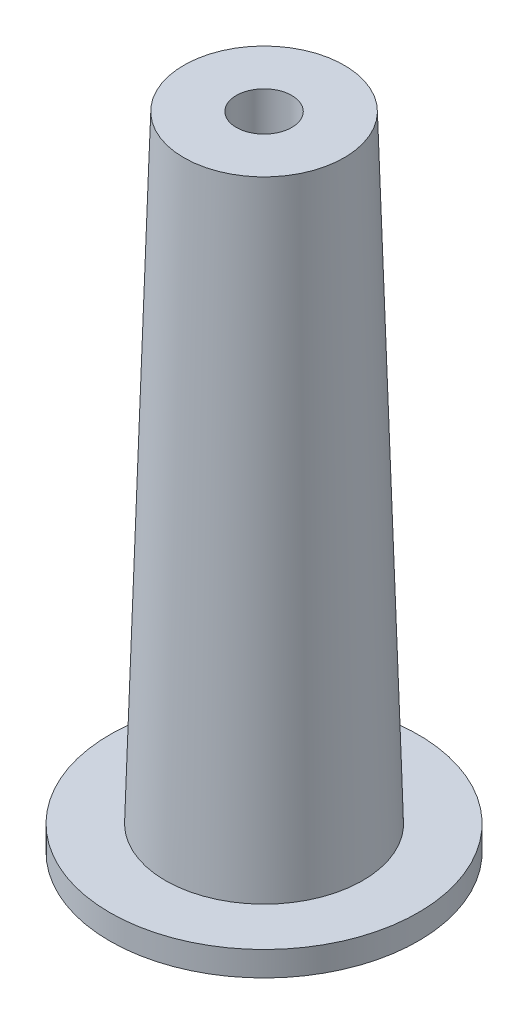
ISO-10303-21;
HEADER;
FILE_DESCRIPTION(('STEP AP214'),'2;1');
FILE_NAME('part.step','',(''),(''),'','','');
FILE_SCHEMA(('AUTOMOTIVE_DESIGN { 1 0 10303 214 1 1 1 1 }'));
ENDSEC;
DATA;
#1=APPLICATION_CONTEXT('core data for automotive mechanical design processes');
#2=APPLICATION_PROTOCOL_DEFINITION('international standard','automotive_design',2000,#1);
#3=PRODUCT_CONTEXT('',#1,'mechanical');
#4=PRODUCT('Part','Part','',(#3));
#5=PRODUCT_RELATED_PRODUCT_CATEGORY('part','',(#4));
#6=PRODUCT_DEFINITION_FORMATION('','',#4);
#7=PRODUCT_DEFINITION_CONTEXT('part definition',#1,'design');
#8=PRODUCT_DEFINITION('design','',#6,#7);
#9=PRODUCT_DEFINITION_SHAPE('','',#8);
#10=(LENGTH_UNIT() NAMED_UNIT(*) SI_UNIT(.MILLI.,.METRE.));
#11=(NAMED_UNIT(*) PLANE_ANGLE_UNIT() SI_UNIT($,.RADIAN.));
#12=(NAMED_UNIT(*) SI_UNIT($,.STERADIAN.) SOLID_ANGLE_UNIT());
#13=UNCERTAINTY_MEASURE_WITH_UNIT(LENGTH_MEASURE(1.E-05),#10,'distance_accuracy_value','');
#14=(GEOMETRIC_REPRESENTATION_CONTEXT(3) GLOBAL_UNCERTAINTY_ASSIGNED_CONTEXT((#13)) GLOBAL_UNIT_ASSIGNED_CONTEXT((#10,
#11,#12)) REPRESENTATION_CONTEXT('',''));
#15=CARTESIAN_POINT('',(0.,0.,0.));
#16=DIRECTION('',(0.,0.,1.));
#17=DIRECTION('',(1.,0.,0.));
#18=AXIS2_PLACEMENT_3D('',#15,#16,#17);
#19=CARTESIAN_POINT('',(0.,4.,0.));
#20=DIRECTION('',(0.,-1.,0.));
#21=DIRECTION('',(0.,0.,-1.));
#22=AXIS2_PLACEMENT_3D('',#19,#20,#21);
#23=CYLINDRICAL_SURFACE('',#22,25.);
#24=CARTESIAN_POINT('',(0.,4.,0.));
#25=DIRECTION('',(0.,1.,0.));
#26=DIRECTION('',(0.,0.,1.));
#27=AXIS2_PLACEMENT_3D('',#24,#25,#26);
#28=CIRCLE('',#27,25.);
#29=CARTESIAN_POINT('',(0.,4.,25.));
#30=VERTEX_POINT('',#29);
#31=EDGE_CURVE('E37',#30,#30,#28,.T.);
#32=ORIENTED_EDGE('',*,*,#31,.F.);
#33=EDGE_LOOP('',(#32));
#34=FACE_BOUND('',#33,.T.);
#35=CARTESIAN_POINT('',(0.,0.,0.));
#36=DIRECTION('',(0.,1.,0.));
#37=DIRECTION('',(0.,0.,1.));
#38=AXIS2_PLACEMENT_3D('',#35,#36,#37);
#39=CIRCLE('',#38,25.);
#40=CARTESIAN_POINT('',(0.,0.,25.));
#41=VERTEX_POINT('',#40);
#42=EDGE_CURVE('E41',#41,#41,#39,.T.);
#43=ORIENTED_EDGE('',*,*,#42,.T.);
#44=EDGE_LOOP('',(#43));
#45=FACE_BOUND('',#44,.T.);
#46=ADVANCED_FACE('F31',(#34,#45),#23,.T.);
#47=CARTESIAN_POINT('',(0.,4.,0.));
#48=DIRECTION('',(0.,1.,0.));
#49=DIRECTION('',(0.,0.,1.));
#50=AXIS2_PLACEMENT_3D('',#47,#48,#49);
#51=PLANE('',#50);
#52=CARTESIAN_POINT('',(0.,4.,0.));
#53=DIRECTION('',(0.,1.,0.));
#54=DIRECTION('',(0.,0.,1.));
#55=AXIS2_PLACEMENT_3D('',#52,#53,#54);
#56=CIRCLE('',#55,16.);
#57=CARTESIAN_POINT('',(0.,4.,16.));
#58=VERTEX_POINT('',#57);
#59=EDGE_CURVE('E10',#58,#58,#56,.T.);
#60=ORIENTED_EDGE('',*,*,#59,.F.);
#61=EDGE_LOOP('',(#60));
#62=FACE_BOUND('',#61,.T.);
#63=ORIENTED_EDGE('',*,*,#31,.T.);
#64=EDGE_LOOP('',(#63));
#65=FACE_BOUND('',#64,.T.);
#66=ADVANCED_FACE('F73',(#62,#65),#51,.T.);
#67=CARTESIAN_POINT('',(0.,0.,0.));
#68=DIRECTION('',(0.,1.,0.));
#69=DIRECTION('',(0.,0.,1.));
#70=AXIS2_PLACEMENT_3D('',#67,#68,#69);
#71=PLANE('',#70);
#72=ORIENTED_EDGE('',*,*,#42,.F.);
#73=EDGE_LOOP('',(#72));
#74=FACE_BOUND('',#73,.T.);
#75=ADVANCED_FACE('F78',(#74),#71,.F.);
#76=CARTESIAN_POINT('',(0.,104.,0.));
#77=DIRECTION('',(0.,-1.,0.));
#78=DIRECTION('',(0.,0.,-1.));
#79=AXIS2_PLACEMENT_3D('',#76,#77,#78);
#80=CONICAL_SURFACE('',#79,13.,0.0299910048568779);
#81=ORIENTED_EDGE('',*,*,#59,.T.);
#82=EDGE_LOOP('',(#81));
#83=FACE_BOUND('',#82,.T.);
#84=CARTESIAN_POINT('',(0.,104.,0.));
#85=DIRECTION('',(0.,1.,0.));
#86=DIRECTION('',(0.,0.,1.));
#87=AXIS2_PLACEMENT_3D('',#84,#85,#86);
#88=CIRCLE('',#87,13.);
#89=CARTESIAN_POINT('',(0.,104.,13.));
#90=VERTEX_POINT('',#89);
#91=EDGE_CURVE('E46',#90,#90,#88,.T.);
#92=ORIENTED_EDGE('',*,*,#91,.F.);
#93=EDGE_LOOP('',(#92));
#94=FACE_BOUND('',#93,.T.);
#95=ADVANCED_FACE('F69',(#83,#94),#80,.T.);
#96=CARTESIAN_POINT('',(0.,104.,13.));
#97=DIRECTION('',(0.,1.,0.));
#98=DIRECTION('',(0.,0.,1.));
#99=AXIS2_PLACEMENT_3D('',#96,#97,#98);
#100=PLANE('',#99);
#101=CARTESIAN_POINT('',(0.,104.,0.));
#102=DIRECTION('',(0.,1.,0.));
#103=DIRECTION('',(0.,0.,1.));
#104=AXIS2_PLACEMENT_3D('',#101,#102,#103);
#105=CIRCLE('',#104,4.5);
#106=CARTESIAN_POINT('',(0.,104.,4.5));
#107=VERTEX_POINT('',#106);
#108=EDGE_CURVE('E50',#107,#107,#105,.T.);
#109=ORIENTED_EDGE('',*,*,#108,.F.);
#110=EDGE_LOOP('',(#109));
#111=FACE_BOUND('',#110,.T.);
#112=ORIENTED_EDGE('',*,*,#91,.T.);
#113=EDGE_LOOP('',(#112));
#114=FACE_BOUND('',#113,.T.);
#115=ADVANCED_FACE('F61',(#111,#114),#100,.T.);
#116=CARTESIAN_POINT('',(0.,104.,0.));
#117=DIRECTION('',(0.,-1.,0.));
#118=DIRECTION('',(0.,0.,-1.));
#119=AXIS2_PLACEMENT_3D('',#116,#117,#118);
#120=CYLINDRICAL_SURFACE('',#119,4.5);
#121=ORIENTED_EDGE('',*,*,#108,.T.);
#122=EDGE_LOOP('',(#121));
#123=FACE_BOUND('',#122,.T.);
#124=CARTESIAN_POINT('',(0.,2.5,0.));
#125=DIRECTION('',(0.,1.,0.));
#126=DIRECTION('',(0.,0.,1.));
#127=AXIS2_PLACEMENT_3D('',#124,#125,#126);
#128=CIRCLE('',#127,4.5);
#129=CARTESIAN_POINT('',(0.,2.5,4.5));
#130=VERTEX_POINT('',#129);
#131=EDGE_CURVE('E53',#130,#130,#128,.T.);
#132=ORIENTED_EDGE('',*,*,#131,.F.);
#133=EDGE_LOOP('',(#132));
#134=FACE_BOUND('',#133,.T.);
#135=ADVANCED_FACE('F59',(#123,#134),#120,.F.);
#136=CARTESIAN_POINT('',(0.,2.5,0.));
#137=DIRECTION('',(0.,1.,0.));
#138=DIRECTION('',(0.,0.,1.));
#139=AXIS2_PLACEMENT_3D('',#136,#137,#138);
#140=PLANE('',#139);
#141=ORIENTED_EDGE('',*,*,#131,.T.);
#142=EDGE_LOOP('',(#141));
#143=FACE_BOUND('',#142,.T.);
#144=ADVANCED_FACE('F57',(#143),#140,.T.);
#145=CLOSED_SHELL('',(#46,#66,#75,#95,#115,#135,#144));
#146=MANIFOLD_SOLID_BREP('B2',#145);
#147=ADVANCED_BREP_SHAPE_REPRESENTATION('',(#18,#146),#14);
#148=SHAPE_DEFINITION_REPRESENTATION(#9,#147);
ENDSEC;
END-ISO-10303-21;
